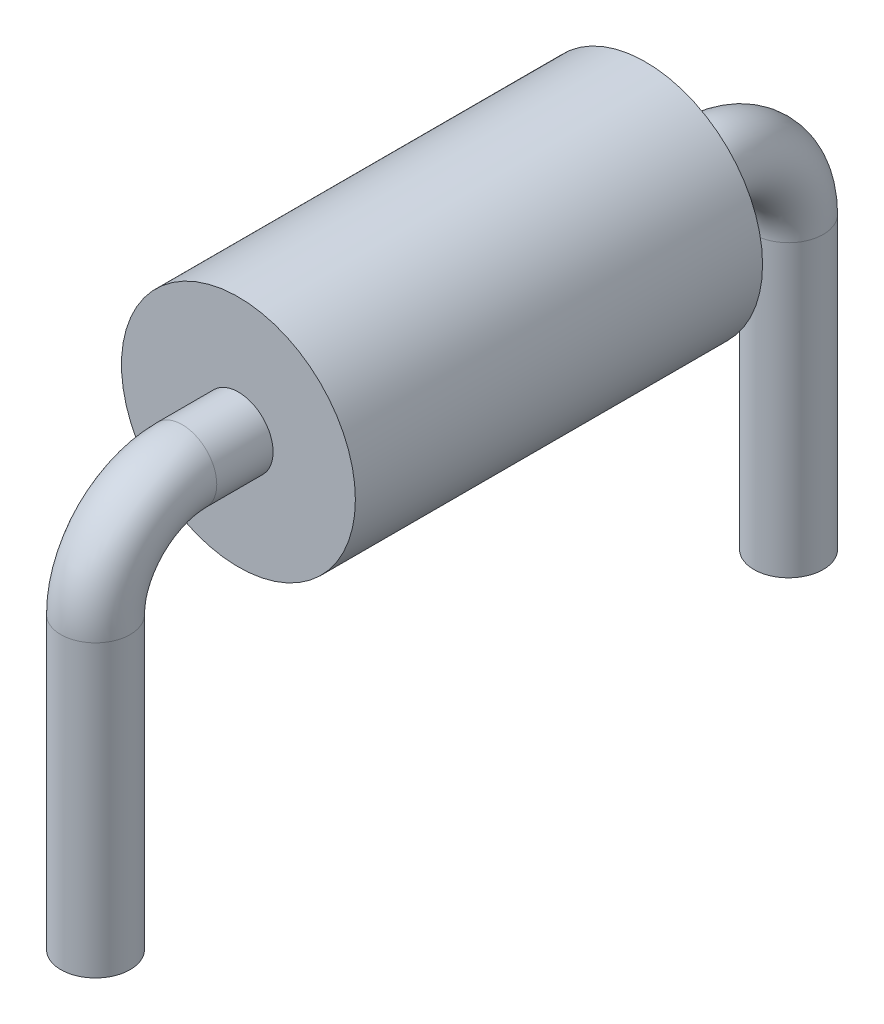
ISO-10303-21;
HEADER;
FILE_DESCRIPTION(('STEP AP214'),'2;1');
FILE_NAME('part.step','',(''),(''),'','','');
FILE_SCHEMA(('AUTOMOTIVE_DESIGN { 1 0 10303 214 1 1 1 1 }'));
ENDSEC;
DATA;
#1=APPLICATION_CONTEXT('core data for automotive mechanical design processes');
#2=APPLICATION_PROTOCOL_DEFINITION('international standard','automotive_design',2000,#1);
#3=PRODUCT_CONTEXT('',#1,'mechanical');
#4=PRODUCT('Part','Part','',(#3));
#5=PRODUCT_RELATED_PRODUCT_CATEGORY('part','',(#4));
#6=PRODUCT_DEFINITION_FORMATION('','',#4);
#7=PRODUCT_DEFINITION_CONTEXT('part definition',#1,'design');
#8=PRODUCT_DEFINITION('design','',#6,#7);
#9=PRODUCT_DEFINITION_SHAPE('','',#8);
#10=(LENGTH_UNIT() NAMED_UNIT(*) SI_UNIT(.MILLI.,.METRE.));
#11=(NAMED_UNIT(*) PLANE_ANGLE_UNIT() SI_UNIT($,.RADIAN.));
#12=(NAMED_UNIT(*) SI_UNIT($,.STERADIAN.) SOLID_ANGLE_UNIT());
#13=UNCERTAINTY_MEASURE_WITH_UNIT(LENGTH_MEASURE(1.E-05),#10,'distance_accuracy_value','');
#14=(GEOMETRIC_REPRESENTATION_CONTEXT(3) GLOBAL_UNCERTAINTY_ASSIGNED_CONTEXT((#13)) GLOBAL_UNIT_ASSIGNED_CONTEXT((#10,
#11,#12)) REPRESENTATION_CONTEXT('',''));
#15=CARTESIAN_POINT('',(0.,0.,0.));
#16=DIRECTION('',(0.,0.,1.));
#17=DIRECTION('',(1.,0.,0.));
#18=AXIS2_PLACEMENT_3D('',#15,#16,#17);
#19=CARTESIAN_POINT('',(0.,0.,2.35));
#20=DIRECTION('',(0.,0.,-1.));
#21=DIRECTION('',(-1.,0.,0.));
#22=AXIS2_PLACEMENT_3D('',#19,#20,#21);
#23=CYLINDRICAL_SURFACE('',#22,1.35);
#24=CARTESIAN_POINT('',(0.,0.,2.35));
#25=DIRECTION('',(0.,0.,1.));
#26=DIRECTION('',(1.,0.,0.));
#27=AXIS2_PLACEMENT_3D('',#24,#25,#26);
#28=CIRCLE('',#27,1.35);
#29=CARTESIAN_POINT('',(1.35,0.,2.35));
#30=VERTEX_POINT('',#29);
#31=EDGE_CURVE('E45',#30,#30,#28,.T.);
#32=ORIENTED_EDGE('',*,*,#31,.F.);
#33=EDGE_LOOP('',(#32));
#34=FACE_BOUND('',#33,.T.);
#35=CARTESIAN_POINT('',(0.,0.,-2.35));
#36=DIRECTION('',(0.,0.,1.));
#37=DIRECTION('',(1.,0.,0.));
#38=AXIS2_PLACEMENT_3D('',#35,#36,#37);
#39=CIRCLE('',#38,1.35);
#40=CARTESIAN_POINT('',(1.35,0.,-2.35));
#41=VERTEX_POINT('',#40);
#42=EDGE_CURVE('E36',#41,#41,#39,.T.);
#43=ORIENTED_EDGE('',*,*,#42,.T.);
#44=EDGE_LOOP('',(#43));
#45=FACE_BOUND('',#44,.T.);
#46=ADVANCED_FACE('F33',(#34,#45),#23,.T.);
#47=CARTESIAN_POINT('',(0.,0.,2.35));
#48=DIRECTION('',(0.,0.,1.));
#49=DIRECTION('',(1.,0.,0.));
#50=AXIS2_PLACEMENT_3D('',#47,#48,#49);
#51=PLANE('',#50);
#52=CARTESIAN_POINT('',(0.,0.,2.35));
#53=DIRECTION('',(0.,0.,1.));
#54=DIRECTION('',(1.,0.,0.));
#55=AXIS2_PLACEMENT_3D('',#52,#53,#54);
#56=CIRCLE('',#55,0.4);
#57=CARTESIAN_POINT('',(0.4,0.,2.35));
#58=VERTEX_POINT('',#57);
#59=EDGE_CURVE('E10',#58,#58,#56,.T.);
#60=ORIENTED_EDGE('',*,*,#59,.F.);
#61=EDGE_LOOP('',(#60));
#62=FACE_BOUND('',#61,.T.);
#63=ORIENTED_EDGE('',*,*,#31,.T.);
#64=EDGE_LOOP('',(#63));
#65=FACE_BOUND('',#64,.T.);
#66=ADVANCED_FACE('F75',(#62,#65),#51,.T.);
#67=CARTESIAN_POINT('',(0.,0.,-2.35));
#68=DIRECTION('',(0.,0.,1.));
#69=DIRECTION('',(1.,0.,0.));
#70=AXIS2_PLACEMENT_3D('',#67,#68,#69);
#71=PLANE('',#70);
#72=CARTESIAN_POINT('',(0.,0.,-2.35));
#73=DIRECTION('',(0.,0.,-1.));
#74=DIRECTION('',(-1.,0.,0.));
#75=AXIS2_PLACEMENT_3D('',#72,#73,#74);
#76=CIRCLE('',#75,0.4);
#77=CARTESIAN_POINT('',(-0.4,0.,-2.35));
#78=VERTEX_POINT('',#77);
#79=EDGE_CURVE('E40',#78,#78,#76,.T.);
#80=ORIENTED_EDGE('',*,*,#79,.F.);
#81=EDGE_LOOP('',(#80));
#82=FACE_BOUND('',#81,.T.);
#83=ORIENTED_EDGE('',*,*,#42,.F.);
#84=EDGE_LOOP('',(#83));
#85=FACE_BOUND('',#84,.T.);
#86=ADVANCED_FACE('F72',(#82,#85),#71,.F.);
#87=CARTESIAN_POINT('',(0.,-4.35,-4.));
#88=DIRECTION('',(0.,-1.,0.));
#89=DIRECTION('',(-1.,0.,0.));
#90=AXIS2_PLACEMENT_3D('',#87,#88,#89);
#91=PLANE('',#90);
#92=CARTESIAN_POINT('',(0.,-4.35,-4.));
#93=DIRECTION('',(0.,-1.,0.));
#94=DIRECTION('',(-1.,0.,0.));
#95=AXIS2_PLACEMENT_3D('',#92,#93,#94);
#96=CIRCLE('',#95,0.4);
#97=CARTESIAN_POINT('',(-0.4,-4.35,-4.));
#98=VERTEX_POINT('',#97);
#99=EDGE_CURVE('E63',#98,#98,#96,.T.);
#100=ORIENTED_EDGE('',*,*,#99,.T.);
#101=EDGE_LOOP('',(#100));
#102=FACE_BOUND('',#101,.T.);
#103=ADVANCED_FACE('F74',(#102),#91,.T.);
#104=CARTESIAN_POINT('',(0.,0.,-2.35));
#105=DIRECTION('',(0.,0.,-1.));
#106=DIRECTION('',(-1.,0.,0.));
#107=AXIS2_PLACEMENT_3D('',#104,#105,#106);
#108=CYLINDRICAL_SURFACE('',#107,0.4);
#109=CARTESIAN_POINT('',(0.,0.,-3.));
#110=DIRECTION('',(0.,0.,-1.));
#111=DIRECTION('',(-1.,0.,0.));
#112=AXIS2_PLACEMENT_3D('',#109,#110,#111);
#113=CIRCLE('',#112,0.4);
#114=CARTESIAN_POINT('',(0.,0.4,-3.));
#115=VERTEX_POINT('',#114);
#116=EDGE_CURVE('E56',#115,#115,#113,.T.);
#117=ORIENTED_EDGE('',*,*,#116,.F.);
#118=EDGE_LOOP('',(#117));
#119=FACE_BOUND('',#118,.T.);
#120=ORIENTED_EDGE('',*,*,#79,.T.);
#121=EDGE_LOOP('',(#120));
#122=FACE_BOUND('',#121,.T.);
#123=ADVANCED_FACE('F82',(#119,#122),#108,.T.);
#124=CARTESIAN_POINT('',(0.,-1.,-3.));
#125=DIRECTION('',(-1.,0.,0.));
#126=DIRECTION('',(0.,0.,1.));
#127=AXIS2_PLACEMENT_3D('',#124,#125,#126);
#128=TOROIDAL_SURFACE('',#127,1.,0.4);
#129=CARTESIAN_POINT('',(0.,-1.,-4.));
#130=DIRECTION('',(0.,-1.,0.));
#131=DIRECTION('',(-1.,0.,0.));
#132=AXIS2_PLACEMENT_3D('',#129,#130,#131);
#133=CIRCLE('',#132,0.4);
#134=CARTESIAN_POINT('',(0.,-1.,-4.4));
#135=VERTEX_POINT('',#134);
#136=EDGE_CURVE('E60',#135,#135,#133,.T.);
#137=CARTESIAN_POINT('',(0.,-1.,-3.));
#138=DIRECTION('',(-1.,0.,0.));
#139=DIRECTION('',(0.,0.,1.));
#140=AXIS2_PLACEMENT_3D('',#137,#138,#139);
#141=CIRCLE('',#140,1.4);
#142=EDGE_CURVE('',#115,#135,#141,.T.);
#143=ORIENTED_EDGE('',*,*,#116,.T.);
#144=ORIENTED_EDGE('',*,*,#136,.F.);
#145=ORIENTED_EDGE('',*,*,#142,.T.);
#146=ORIENTED_EDGE('',*,*,#142,.F.);
#147=EDGE_LOOP('',(#143,#145,#144,#146));
#148=FACE_BOUND('',#147,.T.);
#149=ADVANCED_FACE('F91',(#148),#128,.T.);
#150=CARTESIAN_POINT('',(0.,-1.,-4.));
#151=DIRECTION('',(0.,-1.,0.));
#152=DIRECTION('',(0.,0.,-1.));
#153=AXIS2_PLACEMENT_3D('',#150,#151,#152);
#154=CYLINDRICAL_SURFACE('',#153,0.4);
#155=ORIENTED_EDGE('',*,*,#99,.F.);
#156=EDGE_LOOP('',(#155));
#157=FACE_BOUND('',#156,.T.);
#158=ORIENTED_EDGE('',*,*,#136,.T.);
#159=EDGE_LOOP('',(#158));
#160=FACE_BOUND('',#159,.T.);
#161=ADVANCED_FACE('F77',(#157,#160),#154,.T.);
#162=CARTESIAN_POINT('',(0.,-4.35,4.));
#163=DIRECTION('',(0.,-1.,0.));
#164=DIRECTION('',(1.,0.,0.));
#165=AXIS2_PLACEMENT_3D('',#162,#163,#164);
#166=PLANE('',#165);
#167=CARTESIAN_POINT('',(0.,-4.35,4.));
#168=DIRECTION('',(0.,-1.,0.));
#169=DIRECTION('',(1.,0.,0.));
#170=AXIS2_PLACEMENT_3D('',#167,#168,#169);
#171=CIRCLE('',#170,0.4);
#172=CARTESIAN_POINT('',(0.4,-4.35,4.));
#173=VERTEX_POINT('',#172);
#174=EDGE_CURVE('E54',#173,#173,#171,.T.);
#175=ORIENTED_EDGE('',*,*,#174,.T.);
#176=EDGE_LOOP('',(#175));
#177=FACE_BOUND('',#176,.T.);
#178=ADVANCED_FACE('F90',(#177),#166,.T.);
#179=CARTESIAN_POINT('',(0.,0.,2.35));
#180=DIRECTION('',(0.,0.,1.));
#181=DIRECTION('',(0.,-1.,0.));
#182=AXIS2_PLACEMENT_3D('',#179,#180,#181);
#183=CYLINDRICAL_SURFACE('',#182,0.4);
#184=CARTESIAN_POINT('',(0.,0.,3.));
#185=DIRECTION('',(0.,0.,1.));
#186=DIRECTION('',(1.,0.,0.));
#187=AXIS2_PLACEMENT_3D('',#184,#185,#186);
#188=CIRCLE('',#187,0.4);
#189=CARTESIAN_POINT('',(0.,0.399999999999999,3.));
#190=VERTEX_POINT('',#189);
#191=EDGE_CURVE('E48',#190,#190,#188,.T.);
#192=ORIENTED_EDGE('',*,*,#191,.F.);
#193=EDGE_LOOP('',(#192));
#194=FACE_BOUND('',#193,.T.);
#195=ORIENTED_EDGE('',*,*,#59,.T.);
#196=EDGE_LOOP('',(#195));
#197=FACE_BOUND('',#196,.T.);
#198=ADVANCED_FACE('F116',(#194,#197),#183,.T.);
#199=CARTESIAN_POINT('',(0.,-1.,3.));
#200=DIRECTION('',(1.,0.,0.));
#201=DIRECTION('',(0.,0.,-1.));
#202=AXIS2_PLACEMENT_3D('',#199,#200,#201);
#203=TOROIDAL_SURFACE('',#202,1.,0.4);
#204=CARTESIAN_POINT('',(0.,-1.,4.));
#205=DIRECTION('',(0.,-1.,0.));
#206=DIRECTION('',(1.,0.,0.));
#207=AXIS2_PLACEMENT_3D('',#204,#205,#206);
#208=CIRCLE('',#207,0.4);
#209=CARTESIAN_POINT('',(0.,-1.,4.4));
#210=VERTEX_POINT('',#209);
#211=EDGE_CURVE('E51',#210,#210,#208,.T.);
#212=CARTESIAN_POINT('',(0.,-1.,3.));
#213=DIRECTION('',(1.,0.,0.));
#214=DIRECTION('',(0.,0.,-1.));
#215=AXIS2_PLACEMENT_3D('',#212,#213,#214);
#216=CIRCLE('',#215,1.4);
#217=EDGE_CURVE('',#190,#210,#216,.T.);
#218=ORIENTED_EDGE('',*,*,#191,.T.);
#219=ORIENTED_EDGE('',*,*,#211,.F.);
#220=ORIENTED_EDGE('',*,*,#217,.T.);
#221=ORIENTED_EDGE('',*,*,#217,.F.);
#222=EDGE_LOOP('',(#218,#220,#219,#221));
#223=FACE_BOUND('',#222,.T.);
#224=ADVANCED_FACE('F126',(#223),#203,.T.);
#225=CARTESIAN_POINT('',(0.,-1.,4.));
#226=DIRECTION('',(0.,-1.,0.));
#227=DIRECTION('',(0.,0.,-1.));
#228=AXIS2_PLACEMENT_3D('',#225,#226,#227);
#229=CYLINDRICAL_SURFACE('',#228,0.4);
#230=ORIENTED_EDGE('',*,*,#174,.F.);
#231=EDGE_LOOP('',(#230));
#232=FACE_BOUND('',#231,.T.);
#233=ORIENTED_EDGE('',*,*,#211,.T.);
#234=EDGE_LOOP('',(#233));
#235=FACE_BOUND('',#234,.T.);
#236=ADVANCED_FACE('F85',(#232,#235),#229,.T.);
#237=CLOSED_SHELL('',(#46,#66,#86,#103,#123,#149,#161,#178,#198,#224,#236));
#238=MANIFOLD_SOLID_BREP('B2',#237);
#239=ADVANCED_BREP_SHAPE_REPRESENTATION('',(#18,#238),#14);
#240=SHAPE_DEFINITION_REPRESENTATION(#9,#239);
ENDSEC;
END-ISO-10303-21;
